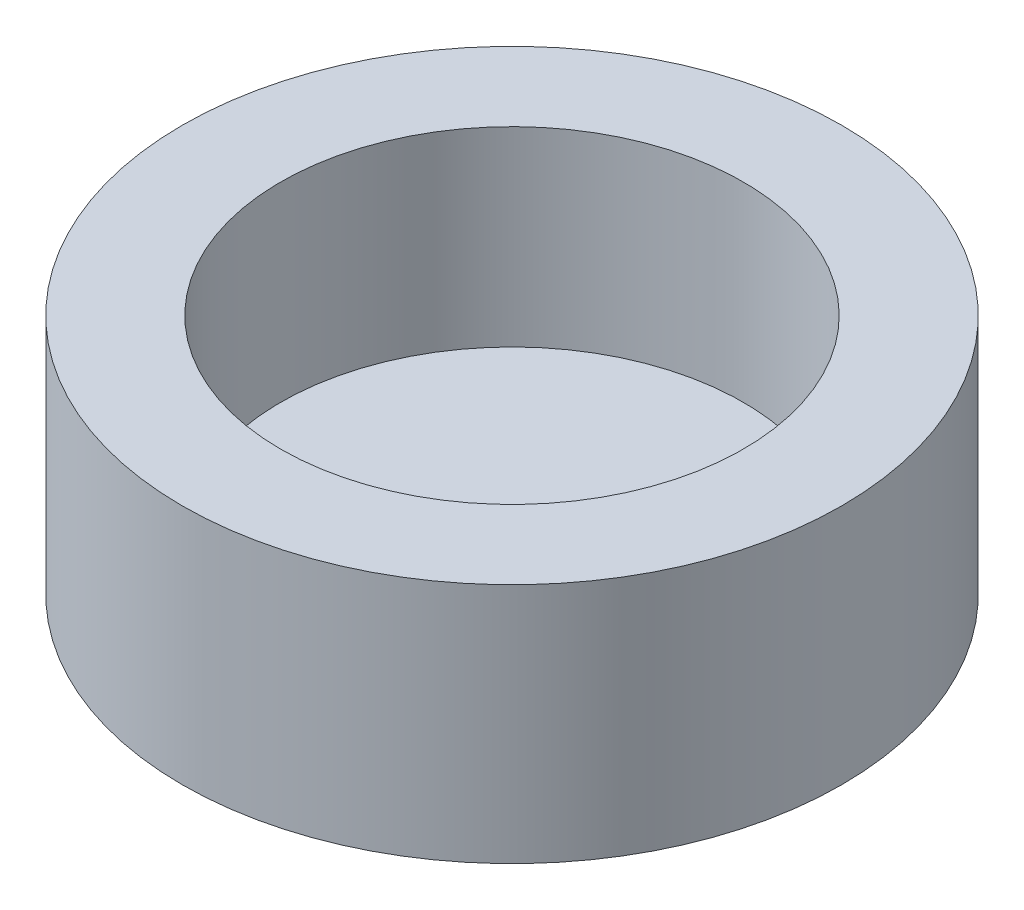
ISO-10303-21;
HEADER;
FILE_DESCRIPTION(('STEP AP214'),'2;1');
FILE_NAME('part.step','',(''),(''),'','','');
FILE_SCHEMA(('AUTOMOTIVE_DESIGN { 1 0 10303 214 1 1 1 1 }'));
ENDSEC;
DATA;
#1=APPLICATION_CONTEXT('core data for automotive mechanical design processes');
#2=APPLICATION_PROTOCOL_DEFINITION('international standard','automotive_design',2000,#1);
#3=PRODUCT_CONTEXT('',#1,'mechanical');
#4=PRODUCT('Part','Part','',(#3));
#5=PRODUCT_RELATED_PRODUCT_CATEGORY('part','',(#4));
#6=PRODUCT_DEFINITION_FORMATION('','',#4);
#7=PRODUCT_DEFINITION_CONTEXT('part definition',#1,'design');
#8=PRODUCT_DEFINITION('design','',#6,#7);
#9=PRODUCT_DEFINITION_SHAPE('','',#8);
#10=(LENGTH_UNIT() NAMED_UNIT(*) SI_UNIT(.MILLI.,.METRE.));
#11=(NAMED_UNIT(*) PLANE_ANGLE_UNIT() SI_UNIT($,.RADIAN.));
#12=(NAMED_UNIT(*) SI_UNIT($,.STERADIAN.) SOLID_ANGLE_UNIT());
#13=UNCERTAINTY_MEASURE_WITH_UNIT(LENGTH_MEASURE(1.E-05),#10,'distance_accuracy_value','');
#14=(GEOMETRIC_REPRESENTATION_CONTEXT(3) GLOBAL_UNCERTAINTY_ASSIGNED_CONTEXT((#13)) GLOBAL_UNIT_ASSIGNED_CONTEXT((#10,
#11,#12)) REPRESENTATION_CONTEXT('',''));
#15=CARTESIAN_POINT('',(0.,0.,0.));
#16=DIRECTION('',(0.,0.,1.));
#17=DIRECTION('',(1.,0.,0.));
#18=AXIS2_PLACEMENT_3D('',#15,#16,#17);
#19=CARTESIAN_POINT('',(0.,25.4,0.));
#20=DIRECTION('',(0.,-1.,0.));
#21=DIRECTION('',(0.,0.,-1.));
#22=AXIS2_PLACEMENT_3D('',#19,#20,#21);
#23=CYLINDRICAL_SURFACE('',#22,34.671);
#24=CARTESIAN_POINT('',(0.,25.4,0.));
#25=DIRECTION('',(0.,1.,0.));
#26=DIRECTION('',(0.,0.,1.));
#27=AXIS2_PLACEMENT_3D('',#24,#25,#26);
#28=CIRCLE('',#27,34.671);
#29=CARTESIAN_POINT('',(0.,25.4,34.671));
#30=VERTEX_POINT('',#29);
#31=EDGE_CURVE('E10',#30,#30,#28,.T.);
#32=ORIENTED_EDGE('',*,*,#31,.F.);
#33=EDGE_LOOP('',(#32));
#34=FACE_BOUND('',#33,.T.);
#35=CARTESIAN_POINT('',(0.,0.,0.));
#36=DIRECTION('',(0.,1.,0.));
#37=DIRECTION('',(0.,0.,1.));
#38=AXIS2_PLACEMENT_3D('',#35,#36,#37);
#39=CIRCLE('',#38,34.671);
#40=CARTESIAN_POINT('',(0.,0.,34.671));
#41=VERTEX_POINT('',#40);
#42=EDGE_CURVE('E34',#41,#41,#39,.T.);
#43=ORIENTED_EDGE('',*,*,#42,.T.);
#44=EDGE_LOOP('',(#43));
#45=FACE_BOUND('',#44,.T.);
#46=ADVANCED_FACE('F31',(#34,#45),#23,.T.);
#47=CARTESIAN_POINT('',(0.,25.4,0.));
#48=DIRECTION('',(0.,1.,0.));
#49=DIRECTION('',(0.,0.,1.));
#50=AXIS2_PLACEMENT_3D('',#47,#48,#49);
#51=PLANE('',#50);
#52=CARTESIAN_POINT('',(0.,25.4,0.));
#53=DIRECTION('',(0.,1.,0.));
#54=DIRECTION('',(0.,0.,1.));
#55=AXIS2_PLACEMENT_3D('',#52,#53,#54);
#56=CIRCLE('',#55,24.3315415439422);
#57=CARTESIAN_POINT('',(0.,25.4,24.3315415439422));
#58=VERTEX_POINT('',#57);
#59=EDGE_CURVE('E43',#58,#58,#56,.T.);
#60=ORIENTED_EDGE('',*,*,#59,.F.);
#61=EDGE_LOOP('',(#60));
#62=FACE_BOUND('',#61,.T.);
#63=ORIENTED_EDGE('',*,*,#31,.T.);
#64=EDGE_LOOP('',(#63));
#65=FACE_BOUND('',#64,.T.);
#66=ADVANCED_FACE('F58',(#62,#65),#51,.T.);
#67=CARTESIAN_POINT('',(0.,0.,0.));
#68=DIRECTION('',(0.,1.,0.));
#69=DIRECTION('',(0.,0.,1.));
#70=AXIS2_PLACEMENT_3D('',#67,#68,#69);
#71=PLANE('',#70);
#72=ORIENTED_EDGE('',*,*,#42,.F.);
#73=EDGE_LOOP('',(#72));
#74=FACE_BOUND('',#73,.T.);
#75=ADVANCED_FACE('F54',(#74),#71,.F.);
#76=CARTESIAN_POINT('',(0.,5.334,0.));
#77=DIRECTION('',(0.,1.,0.));
#78=DIRECTION('',(0.,0.,1.));
#79=AXIS2_PLACEMENT_3D('',#76,#77,#78);
#80=CYLINDRICAL_SURFACE('',#79,24.3315415439422);
#81=CARTESIAN_POINT('',(0.,5.334,0.));
#82=DIRECTION('',(0.,1.,0.));
#83=DIRECTION('',(0.,0.,1.));
#84=AXIS2_PLACEMENT_3D('',#81,#82,#83);
#85=CIRCLE('',#84,24.3315415439422);
#86=CARTESIAN_POINT('',(0.,5.334,24.3315415439422));
#87=VERTEX_POINT('',#86);
#88=EDGE_CURVE('E41',#87,#87,#85,.T.);
#89=ORIENTED_EDGE('',*,*,#88,.F.);
#90=EDGE_LOOP('',(#89));
#91=FACE_BOUND('',#90,.T.);
#92=ORIENTED_EDGE('',*,*,#59,.T.);
#93=EDGE_LOOP('',(#92));
#94=FACE_BOUND('',#93,.T.);
#95=ADVANCED_FACE('F51',(#91,#94),#80,.F.);
#96=CARTESIAN_POINT('',(0.,5.334,0.));
#97=DIRECTION('',(0.,1.,0.));
#98=DIRECTION('',(0.,0.,1.));
#99=AXIS2_PLACEMENT_3D('',#96,#97,#98);
#100=PLANE('',#99);
#101=ORIENTED_EDGE('',*,*,#88,.T.);
#102=EDGE_LOOP('',(#101));
#103=FACE_BOUND('',#102,.T.);
#104=ADVANCED_FACE('F49',(#103),#100,.T.);
#105=CLOSED_SHELL('',(#46,#66,#75,#95,#104));
#106=MANIFOLD_SOLID_BREP('B2',#105);
#107=ADVANCED_BREP_SHAPE_REPRESENTATION('',(#18,#106),#14);
#108=SHAPE_DEFINITION_REPRESENTATION(#9,#107);
ENDSEC;
END-ISO-10303-21;
